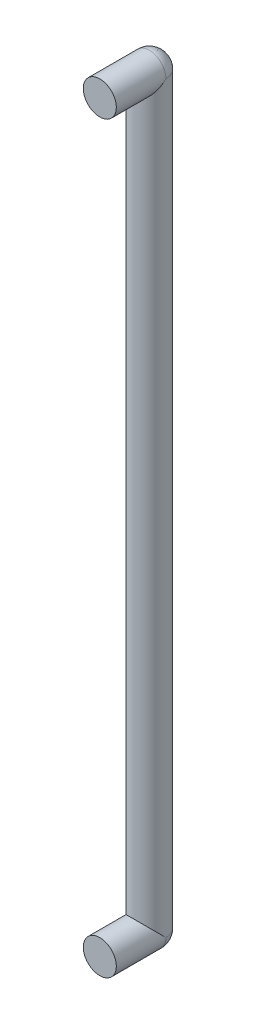
ISO-10303-21;
HEADER;
FILE_DESCRIPTION(('STEP AP214'),'2;1');
FILE_NAME('part.step','',(''),(''),'','','');
FILE_SCHEMA(('AUTOMOTIVE_DESIGN { 1 0 10303 214 1 1 1 1 }'));
ENDSEC;
DATA;
#1=APPLICATION_CONTEXT('core data for automotive mechanical design processes');
#2=APPLICATION_PROTOCOL_DEFINITION('international standard','automotive_design',2000,#1);
#3=PRODUCT_CONTEXT('',#1,'mechanical');
#4=PRODUCT('Part','Part','',(#3));
#5=PRODUCT_RELATED_PRODUCT_CATEGORY('part','',(#4));
#6=PRODUCT_DEFINITION_FORMATION('','',#4);
#7=PRODUCT_DEFINITION_CONTEXT('part definition',#1,'design');
#8=PRODUCT_DEFINITION('design','',#6,#7);
#9=PRODUCT_DEFINITION_SHAPE('','',#8);
#10=(LENGTH_UNIT() NAMED_UNIT(*) SI_UNIT(.MILLI.,.METRE.));
#11=(NAMED_UNIT(*) PLANE_ANGLE_UNIT() SI_UNIT($,.RADIAN.));
#12=(NAMED_UNIT(*) SI_UNIT($,.STERADIAN.) SOLID_ANGLE_UNIT());
#13=UNCERTAINTY_MEASURE_WITH_UNIT(LENGTH_MEASURE(1.E-05),#10,'distance_accuracy_value','');
#14=(GEOMETRIC_REPRESENTATION_CONTEXT(3) GLOBAL_UNCERTAINTY_ASSIGNED_CONTEXT((#13)) GLOBAL_UNIT_ASSIGNED_CONTEXT((#10,
#11,#12)) REPRESENTATION_CONTEXT('',''));
#15=CARTESIAN_POINT('',(0.,0.,0.));
#16=DIRECTION('',(0.,0.,1.));
#17=DIRECTION('',(1.,0.,0.));
#18=AXIS2_PLACEMENT_3D('',#15,#16,#17);
#19=CARTESIAN_POINT('',(0.,4.5,0.));
#20=DIRECTION('',(0.,-1.,0.));
#21=DIRECTION('',(0.,0.,-1.));
#22=AXIS2_PLACEMENT_3D('',#19,#20,#21);
#23=CYLINDRICAL_SURFACE('',#22,0.1);
#24=CARTESIAN_POINT('',(0.,4.5,0.));
#25=DIRECTION('',(0.,-0.707106781186547,-0.707106781186547));
#26=DIRECTION('',(0.,-0.707106781186547,0.707106781186547));
#27=AXIS2_PLACEMENT_3D('',#24,#25,#26);
#28=ELLIPSE('',#27,0.14142135623731,0.1);
#29=CARTESIAN_POINT('',(-0.1,4.5,0.));
#30=VERTEX_POINT('',#29);
#31=CARTESIAN_POINT('',(0.1,4.5,0.));
#32=VERTEX_POINT('',#31);
#33=EDGE_CURVE('E73',#30,#32,#28,.F.);
#34=ORIENTED_EDGE('',*,*,#33,.F.);
#35=CARTESIAN_POINT('',(0.,4.5,0.));
#36=DIRECTION('',(0.,1.,0.));
#37=DIRECTION('',(0.,0.,1.));
#38=AXIS2_PLACEMENT_3D('',#35,#36,#37);
#39=CIRCLE('',#38,0.1);
#40=EDGE_CURVE('E11',#32,#30,#39,.T.);
#41=ORIENTED_EDGE('',*,*,#40,.F.);
#42=EDGE_LOOP('',(#34,#41));
#43=FACE_BOUND('',#42,.T.);
#44=CARTESIAN_POINT('',(0.,0.,0.));
#45=DIRECTION('',(0.,-0.707106781186547,0.707106781186547));
#46=DIRECTION('',(0.,-0.707106781186547,-0.707106781186547));
#47=AXIS2_PLACEMENT_3D('',#44,#45,#46);
#48=ELLIPSE('',#47,0.14142135623731,0.1);
#49=CARTESIAN_POINT('',(0.1,0.,0.));
#50=VERTEX_POINT('',#49);
#51=CARTESIAN_POINT('',(-0.1,0.,0.));
#52=VERTEX_POINT('',#51);
#53=EDGE_CURVE('E71',#50,#52,#48,.T.);
#54=ORIENTED_EDGE('',*,*,#53,.F.);
#55=CARTESIAN_POINT('',(0.,0.,0.));
#56=DIRECTION('',(0.,1.,0.));
#57=DIRECTION('',(0.,0.,1.));
#58=AXIS2_PLACEMENT_3D('',#55,#56,#57);
#59=CIRCLE('',#58,0.1);
#60=EDGE_CURVE('E42',#50,#52,#59,.T.);
#61=ORIENTED_EDGE('',*,*,#60,.T.);
#62=EDGE_LOOP('',(#54,#61));
#63=FACE_BOUND('',#62,.T.);
#64=ADVANCED_FACE('F39',(#43,#63),#23,.T.);
#65=CARTESIAN_POINT('',(0.,4.5,0.3));
#66=DIRECTION('',(0.,0.,-1.));
#67=DIRECTION('',(-1.,0.,0.));
#68=AXIS2_PLACEMENT_3D('',#65,#66,#67);
#69=CYLINDRICAL_SURFACE('',#68,0.1);
#70=CARTESIAN_POINT('',(0.,4.5,0.3));
#71=DIRECTION('',(0.,0.,1.));
#72=DIRECTION('',(1.,0.,0.));
#73=AXIS2_PLACEMENT_3D('',#70,#71,#72);
#74=CIRCLE('',#73,0.1);
#75=CARTESIAN_POINT('',(0.1,4.5,0.3));
#76=VERTEX_POINT('',#75);
#77=EDGE_CURVE('E80',#76,#76,#74,.T.);
#78=ORIENTED_EDGE('',*,*,#77,.F.);
#79=EDGE_LOOP('',(#78));
#80=FACE_BOUND('',#79,.T.);
#81=CARTESIAN_POINT('',(0.,4.5,0.));
#82=DIRECTION('',(0.,0.,1.));
#83=DIRECTION('',(1.,0.,0.));
#84=AXIS2_PLACEMENT_3D('',#81,#82,#83);
#85=CIRCLE('',#84,0.1);
#86=EDGE_CURVE('E76',#32,#30,#85,.T.);
#87=ORIENTED_EDGE('',*,*,#86,.T.);
#88=ORIENTED_EDGE('',*,*,#33,.T.);
#89=EDGE_LOOP('',(#87,#88));
#90=FACE_BOUND('',#89,.T.);
#91=ADVANCED_FACE('F92',(#80,#90),#69,.T.);
#92=CARTESIAN_POINT('',(0.,4.5,0.3));
#93=DIRECTION('',(0.,0.,1.));
#94=DIRECTION('',(1.,0.,0.));
#95=AXIS2_PLACEMENT_3D('',#92,#93,#94);
#96=PLANE('',#95);
#97=ORIENTED_EDGE('',*,*,#77,.T.);
#98=EDGE_LOOP('',(#97));
#99=FACE_BOUND('',#98,.T.);
#100=ADVANCED_FACE('F98',(#99),#96,.T.);
#101=CARTESIAN_POINT('',(0.,0.,0.3));
#102=DIRECTION('',(0.,0.,-1.));
#103=DIRECTION('',(-1.,0.,0.));
#104=AXIS2_PLACEMENT_3D('',#101,#102,#103);
#105=CYLINDRICAL_SURFACE('',#104,0.1);
#106=CARTESIAN_POINT('',(0.,0.,0.3));
#107=DIRECTION('',(0.,0.,1.));
#108=DIRECTION('',(1.,0.,0.));
#109=AXIS2_PLACEMENT_3D('',#106,#107,#108);
#110=CIRCLE('',#109,0.1);
#111=CARTESIAN_POINT('',(0.1,0.,0.3));
#112=VERTEX_POINT('',#111);
#113=EDGE_CURVE('E68',#112,#112,#110,.T.);
#114=ORIENTED_EDGE('',*,*,#113,.F.);
#115=EDGE_LOOP('',(#114));
#116=FACE_BOUND('',#115,.T.);
#117=CARTESIAN_POINT('',(0.,0.,0.));
#118=DIRECTION('',(0.,0.,1.));
#119=DIRECTION('',(1.,0.,0.));
#120=AXIS2_PLACEMENT_3D('',#117,#118,#119);
#121=CIRCLE('',#120,0.1);
#122=EDGE_CURVE('E63',#52,#50,#121,.T.);
#123=ORIENTED_EDGE('',*,*,#122,.T.);
#124=ORIENTED_EDGE('',*,*,#53,.T.);
#125=EDGE_LOOP('',(#123,#124));
#126=FACE_BOUND('',#125,.T.);
#127=ADVANCED_FACE('F74',(#116,#126),#105,.T.);
#128=CARTESIAN_POINT('',(0.,0.,0.3));
#129=DIRECTION('',(0.,0.,1.));
#130=DIRECTION('',(1.,0.,0.));
#131=AXIS2_PLACEMENT_3D('',#128,#129,#130);
#132=PLANE('',#131);
#133=ORIENTED_EDGE('',*,*,#113,.T.);
#134=EDGE_LOOP('',(#133));
#135=FACE_BOUND('',#134,.T.);
#136=ADVANCED_FACE('F109',(#135),#132,.T.);
#137=CARTESIAN_POINT('',(0.,4.5,0.));
#138=DIRECTION('',(1.,0.,0.));
#139=DIRECTION('',(0.,0.,-1.));
#140=AXIS2_PLACEMENT_3D('',#137,#138,#139);
#141=SPHERICAL_SURFACE('',#140,0.1);
#142=ORIENTED_EDGE('',*,*,#86,.F.);
#143=ORIENTED_EDGE('',*,*,#40,.T.);
#144=EDGE_LOOP('',(#142,#143));
#145=FACE_BOUND('',#144,.T.);
#146=ADVANCED_FACE('F113',(#145),#141,.T.);
#147=CARTESIAN_POINT('',(0.,0.,0.));
#148=DIRECTION('',(-1.,0.,0.));
#149=DIRECTION('',(0.,0.,-1.));
#150=AXIS2_PLACEMENT_3D('',#147,#148,#149);
#151=SPHERICAL_SURFACE('',#150,0.1);
#152=ORIENTED_EDGE('',*,*,#122,.F.);
#153=ORIENTED_EDGE('',*,*,#60,.F.);
#154=EDGE_LOOP('',(#152,#153));
#155=FACE_BOUND('',#154,.T.);
#156=ADVANCED_FACE('F64',(#155),#151,.T.);
#157=CLOSED_SHELL('',(#64,#91,#100,#127,#136,#146,#156));
#158=MANIFOLD_SOLID_BREP('B2',#157);
#159=ADVANCED_BREP_SHAPE_REPRESENTATION('',(#18,#158),#14);
#160=SHAPE_DEFINITION_REPRESENTATION(#9,#159);
ENDSEC;
END-ISO-10303-21;
